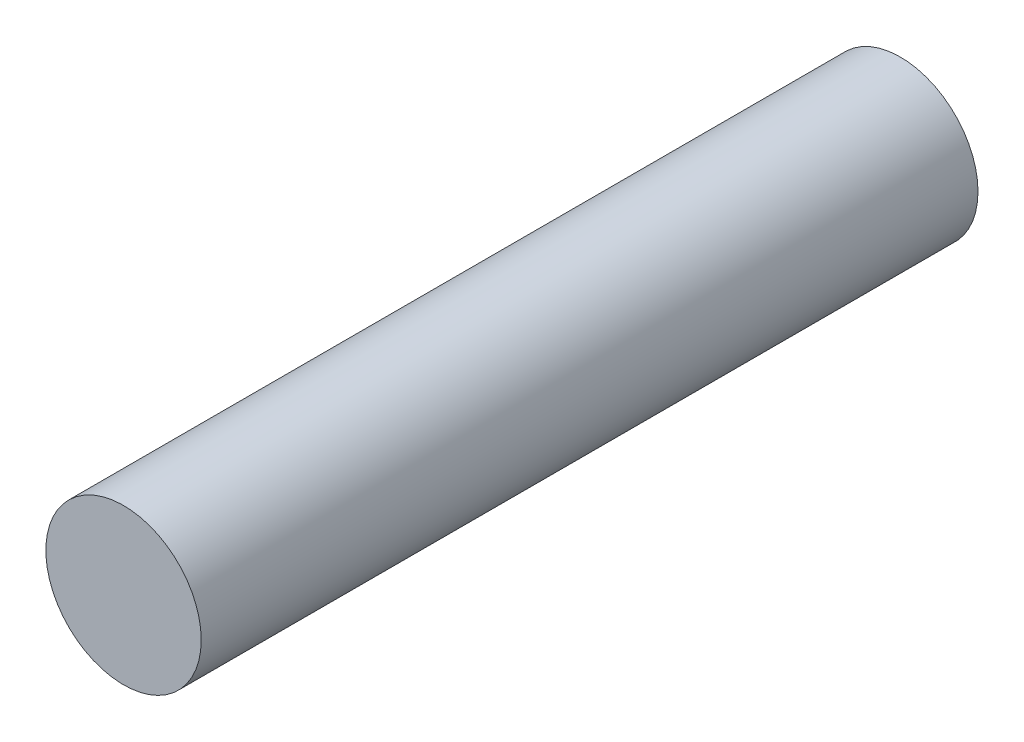
ISO-10303-21;
HEADER;
FILE_DESCRIPTION(('STEP AP214'),'2;1');
FILE_NAME('part.step','',(''),(''),'','','');
FILE_SCHEMA(('AUTOMOTIVE_DESIGN { 1 0 10303 214 1 1 1 1 }'));
ENDSEC;
DATA;
#1=APPLICATION_CONTEXT('core data for automotive mechanical design processes');
#2=APPLICATION_PROTOCOL_DEFINITION('international standard','automotive_design',2000,#1);
#3=PRODUCT_CONTEXT('',#1,'mechanical');
#4=PRODUCT('Part','Part','',(#3));
#5=PRODUCT_RELATED_PRODUCT_CATEGORY('part','',(#4));
#6=PRODUCT_DEFINITION_FORMATION('','',#4);
#7=PRODUCT_DEFINITION_CONTEXT('part definition',#1,'design');
#8=PRODUCT_DEFINITION('design','',#6,#7);
#9=PRODUCT_DEFINITION_SHAPE('','',#8);
#10=(LENGTH_UNIT() NAMED_UNIT(*) SI_UNIT(.MILLI.,.METRE.));
#11=(NAMED_UNIT(*) PLANE_ANGLE_UNIT() SI_UNIT($,.RADIAN.));
#12=(NAMED_UNIT(*) SI_UNIT($,.STERADIAN.) SOLID_ANGLE_UNIT());
#13=UNCERTAINTY_MEASURE_WITH_UNIT(LENGTH_MEASURE(1.E-05),#10,'distance_accuracy_value','');
#14=(GEOMETRIC_REPRESENTATION_CONTEXT(3) GLOBAL_UNCERTAINTY_ASSIGNED_CONTEXT((#13)) GLOBAL_UNIT_ASSIGNED_CONTEXT((#10,
#11,#12)) REPRESENTATION_CONTEXT('',''));
#15=CARTESIAN_POINT('',(0.,0.,0.));
#16=DIRECTION('',(0.,0.,1.));
#17=DIRECTION('',(1.,0.,0.));
#18=AXIS2_PLACEMENT_3D('',#15,#16,#17);
#19=CARTESIAN_POINT('',(0.,0.,10.));
#20=DIRECTION('',(0.,0.,-1.));
#21=DIRECTION('',(-1.,0.,0.));
#22=AXIS2_PLACEMENT_3D('',#19,#20,#21);
#23=CYLINDRICAL_SURFACE('',#22,1.);
#24=CARTESIAN_POINT('',(0.,0.,10.));
#25=DIRECTION('',(0.,0.,1.));
#26=DIRECTION('',(1.,0.,0.));
#27=AXIS2_PLACEMENT_3D('',#24,#25,#26);
#28=CIRCLE('',#27,1.);
#29=CARTESIAN_POINT('',(1.,0.,10.));
#30=VERTEX_POINT('',#29);
#31=EDGE_CURVE('E10',#30,#30,#28,.T.);
#32=ORIENTED_EDGE('',*,*,#31,.F.);
#33=EDGE_LOOP('',(#32));
#34=FACE_BOUND('',#33,.T.);
#35=CARTESIAN_POINT('',(0.,0.,0.));
#36=DIRECTION('',(0.,0.,1.));
#37=DIRECTION('',(1.,0.,0.));
#38=AXIS2_PLACEMENT_3D('',#35,#36,#37);
#39=CIRCLE('',#38,1.);
#40=CARTESIAN_POINT('',(1.,0.,0.));
#41=VERTEX_POINT('',#40);
#42=EDGE_CURVE('E40',#41,#41,#39,.T.);
#43=ORIENTED_EDGE('',*,*,#42,.T.);
#44=EDGE_LOOP('',(#43));
#45=FACE_BOUND('',#44,.T.);
#46=ADVANCED_FACE('F37',(#34,#45),#23,.T.);
#47=CARTESIAN_POINT('',(0.,0.,10.));
#48=DIRECTION('',(0.,0.,1.));
#49=DIRECTION('',(1.,0.,0.));
#50=AXIS2_PLACEMENT_3D('',#47,#48,#49);
#51=PLANE('',#50);
#52=ORIENTED_EDGE('',*,*,#31,.T.);
#53=EDGE_LOOP('',(#52));
#54=FACE_BOUND('',#53,.T.);
#55=ADVANCED_FACE('F54',(#54),#51,.T.);
#56=CARTESIAN_POINT('',(0.,0.,0.));
#57=DIRECTION('',(0.,0.,1.));
#58=DIRECTION('',(1.,0.,0.));
#59=AXIS2_PLACEMENT_3D('',#56,#57,#58);
#60=PLANE('',#59);
#61=ORIENTED_EDGE('',*,*,#42,.F.);
#62=EDGE_LOOP('',(#61));
#63=FACE_BOUND('',#62,.T.);
#64=ADVANCED_FACE('F52',(#63),#60,.F.);
#65=CLOSED_SHELL('',(#46,#55,#64));
#66=MANIFOLD_SOLID_BREP('B2',#65);
#67=ADVANCED_BREP_SHAPE_REPRESENTATION('',(#18,#66),#14);
#68=SHAPE_DEFINITION_REPRESENTATION(#9,#67);
ENDSEC;
END-ISO-10303-21;
